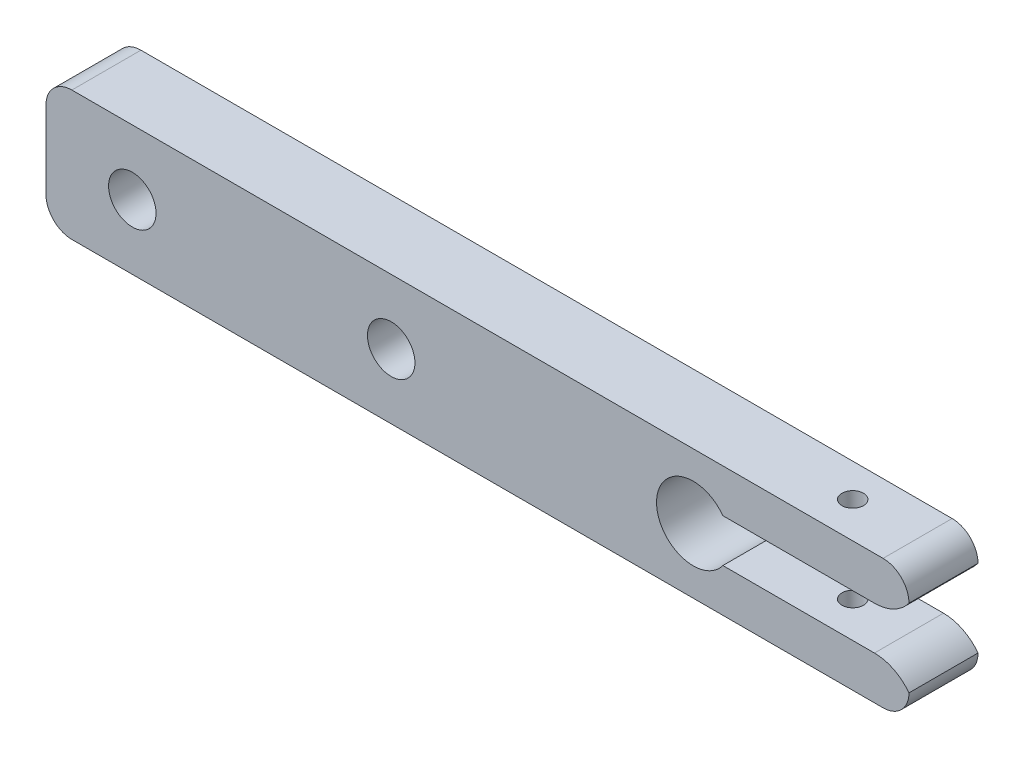
ISO-10303-21;
HEADER;
FILE_DESCRIPTION(('STEP AP214'),'2;1');
FILE_NAME('part.step','',(''),(''),'','','');
FILE_SCHEMA(('AUTOMOTIVE_DESIGN { 1 0 10303 214 1 1 1 1 }'));
ENDSEC;
DATA;
#1=APPLICATION_CONTEXT('core data for automotive mechanical design processes');
#2=APPLICATION_PROTOCOL_DEFINITION('international standard','automotive_design',2000,#1);
#3=PRODUCT_CONTEXT('',#1,'mechanical');
#4=PRODUCT('Part','Part','',(#3));
#5=PRODUCT_RELATED_PRODUCT_CATEGORY('part','',(#4));
#6=PRODUCT_DEFINITION_FORMATION('','',#4);
#7=PRODUCT_DEFINITION_CONTEXT('part definition',#1,'design');
#8=PRODUCT_DEFINITION('design','',#6,#7);
#9=PRODUCT_DEFINITION_SHAPE('','',#8);
#10=(LENGTH_UNIT() NAMED_UNIT(*) SI_UNIT(.MILLI.,.METRE.));
#11=(NAMED_UNIT(*) PLANE_ANGLE_UNIT() SI_UNIT($,.RADIAN.));
#12=(NAMED_UNIT(*) SI_UNIT($,.STERADIAN.) SOLID_ANGLE_UNIT());
#13=UNCERTAINTY_MEASURE_WITH_UNIT(LENGTH_MEASURE(1.E-05),#10,'distance_accuracy_value','');
#14=(GEOMETRIC_REPRESENTATION_CONTEXT(3) GLOBAL_UNCERTAINTY_ASSIGNED_CONTEXT((#13)) GLOBAL_UNIT_ASSIGNED_CONTEXT((#10,
#11,#12)) REPRESENTATION_CONTEXT('',''));
#15=CARTESIAN_POINT('',(0.,0.,0.));
#16=DIRECTION('',(0.,0.,1.));
#17=DIRECTION('',(1.,0.,0.));
#18=AXIS2_PLACEMENT_3D('',#15,#16,#17);
#19=CARTESIAN_POINT('',(-50.0000000000001,-7.50000000000001,8.));
#20=DIRECTION('',(0.,0.,-1.));
#21=DIRECTION('',(-1.,0.,0.));
#22=AXIS2_PLACEMENT_3D('',#19,#20,#21);
#23=PLANE('',#22);
#24=CARTESIAN_POINT('',(46.9999999999999,-4.49999999999999,8.));
#25=DIRECTION('',(0.,0.,-1.));
#26=DIRECTION('',(-1.,0.,0.));
#27=AXIS2_PLACEMENT_3D('',#24,#25,#26);
#28=CIRCLE('',#27,3.);
#29=CARTESIAN_POINT('',(46.9999999999999,-7.49999999999999,8.));
#30=VERTEX_POINT('',#29);
#31=CARTESIAN_POINT('',(49.9999999999999,-4.49999999999999,8.));
#32=VERTEX_POINT('',#31);
#33=EDGE_CURVE('E201',#30,#32,#28,.F.);
#34=ORIENTED_EDGE('',*,*,#33,.T.);
#35=CARTESIAN_POINT('',(45.9999999999999,-7.5,8.));
#36=DIRECTION('',(0.,0.,-1.));
#37=DIRECTION('',(-1.,0.,0.));
#38=AXIS2_PLACEMENT_3D('',#35,#36,#37);
#39=CIRCLE('',#38,5.);
#40=CARTESIAN_POINT('',(45.9999999999999,-2.5,8.));
#41=VERTEX_POINT('',#40);
#42=EDGE_CURVE('E141',#32,#41,#39,.F.);
#43=ORIENTED_EDGE('',*,*,#42,.T.);
#44=DIRECTION('',(1.,0.,0.));
#45=VECTOR('',#44,1.);
#46=CARTESIAN_POINT('',(25.,-2.5,8.));
#47=LINE('',#46,#45);
#48=CARTESIAN_POINT('',(28.4369317712169,-2.5,8.));
#49=VERTEX_POINT('',#48);
#50=EDGE_CURVE('E126',#49,#41,#47,.T.);
#51=ORIENTED_EDGE('',*,*,#50,.F.);
#52=CARTESIAN_POINT('',(25.,0.,8.));
#53=DIRECTION('',(0.,0.,1.));
#54=DIRECTION('',(1.,0.,0.));
#55=AXIS2_PLACEMENT_3D('',#52,#53,#54);
#56=CIRCLE('',#55,4.25000000000001);
#57=CARTESIAN_POINT('',(28.4369317712169,2.5,8.));
#58=VERTEX_POINT('',#57);
#59=EDGE_CURVE('E140',#58,#49,#56,.T.);
#60=ORIENTED_EDGE('',*,*,#59,.F.);
#61=DIRECTION('',(-1.,0.,0.));
#62=VECTOR('',#61,1.);
#63=CARTESIAN_POINT('',(25.,2.5,8.));
#64=LINE('',#63,#62);
#65=CARTESIAN_POINT('',(45.9999999999999,2.5,8.));
#66=VERTEX_POINT('',#65);
#67=EDGE_CURVE('E142',#66,#58,#64,.T.);
#68=ORIENTED_EDGE('',*,*,#67,.F.);
#69=CARTESIAN_POINT('',(45.9999999999999,7.5,8.));
#70=DIRECTION('',(0.,0.,-1.));
#71=DIRECTION('',(-1.,0.,0.));
#72=AXIS2_PLACEMENT_3D('',#69,#70,#71);
#73=CIRCLE('',#72,5.);
#74=CARTESIAN_POINT('',(49.9999999999999,4.49999999999999,8.));
#75=VERTEX_POINT('',#74);
#76=EDGE_CURVE('E216',#66,#75,#73,.F.);
#77=ORIENTED_EDGE('',*,*,#76,.T.);
#78=CARTESIAN_POINT('',(46.9999999999999,4.49999999999999,8.));
#79=DIRECTION('',(0.,0.,-1.));
#80=DIRECTION('',(-1.,0.,0.));
#81=AXIS2_PLACEMENT_3D('',#78,#79,#80);
#82=CIRCLE('',#81,3.);
#83=CARTESIAN_POINT('',(46.9999999999999,7.49999999999999,8.));
#84=VERTEX_POINT('',#83);
#85=EDGE_CURVE('E199',#75,#84,#82,.F.);
#86=ORIENTED_EDGE('',*,*,#85,.T.);
#87=DIRECTION('',(-1.,0.,0.));
#88=VECTOR('',#87,1.);
#89=CARTESIAN_POINT('',(49.9999999999999,7.49999999999999,8.));
#90=LINE('',#89,#88);
#91=CARTESIAN_POINT('',(-47.0000000000001,7.49999999999999,8.));
#92=VERTEX_POINT('',#91);
#93=EDGE_CURVE('E169',#84,#92,#90,.T.);
#94=ORIENTED_EDGE('',*,*,#93,.T.);
#95=CARTESIAN_POINT('',(-47.0000000000001,4.49999999999999,8.));
#96=DIRECTION('',(0.,0.,-1.));
#97=DIRECTION('',(-1.,0.,0.));
#98=AXIS2_PLACEMENT_3D('',#95,#96,#97);
#99=CIRCLE('',#98,3.);
#100=CARTESIAN_POINT('',(-50.0000000000001,4.49999999999999,8.));
#101=VERTEX_POINT('',#100);
#102=EDGE_CURVE('E197',#92,#101,#99,.F.);
#103=ORIENTED_EDGE('',*,*,#102,.T.);
#104=DIRECTION('',(0.,-1.,0.));
#105=VECTOR('',#104,1.);
#106=CARTESIAN_POINT('',(-50.0000000000001,7.49999999999999,8.));
#107=LINE('',#106,#105);
#108=CARTESIAN_POINT('',(-50.0000000000001,-4.5,8.));
#109=VERTEX_POINT('',#108);
#110=EDGE_CURVE('E162',#101,#109,#107,.T.);
#111=ORIENTED_EDGE('',*,*,#110,.T.);
#112=CARTESIAN_POINT('',(-47.0000000000001,-4.5,8.));
#113=DIRECTION('',(0.,0.,-1.));
#114=DIRECTION('',(-1.,0.,0.));
#115=AXIS2_PLACEMENT_3D('',#112,#113,#114);
#116=CIRCLE('',#115,3.);
#117=CARTESIAN_POINT('',(-47.0000000000001,-7.50000000000001,8.));
#118=VERTEX_POINT('',#117);
#119=EDGE_CURVE('E203',#109,#118,#116,.F.);
#120=ORIENTED_EDGE('',*,*,#119,.T.);
#121=DIRECTION('',(1.,0.,0.));
#122=VECTOR('',#121,1.);
#123=CARTESIAN_POINT('',(49.9999999999999,-7.49999999999999,8.));
#124=LINE('',#123,#122);
#125=EDGE_CURVE('E165',#118,#30,#124,.T.);
#126=ORIENTED_EDGE('',*,*,#125,.T.);
#127=EDGE_LOOP('',(#34,#43,#51,#60,#68,#77,#86,#94,#103,#111,#120,#126));
#128=FACE_BOUND('',#127,.T.);
#129=CARTESIAN_POINT('',(-10.,0.,8.));
#130=DIRECTION('',(0.,0.,1.));
#131=DIRECTION('',(1.,0.,0.));
#132=AXIS2_PLACEMENT_3D('',#129,#130,#131);
#133=CIRCLE('',#132,2.75000000000001);
#134=CARTESIAN_POINT('',(-7.25000000000001,0.,8.));
#135=VERTEX_POINT('',#134);
#136=EDGE_CURVE('E151',#135,#135,#133,.T.);
#137=ORIENTED_EDGE('',*,*,#136,.F.);
#138=EDGE_LOOP('',(#137));
#139=FACE_BOUND('',#138,.T.);
#140=CARTESIAN_POINT('',(-40.,0.,8.));
#141=DIRECTION('',(0.,0.,1.));
#142=DIRECTION('',(1.,0.,0.));
#143=AXIS2_PLACEMENT_3D('',#140,#141,#142);
#144=CIRCLE('',#143,2.75000000000002);
#145=CARTESIAN_POINT('',(-37.25,0.,8.));
#146=VERTEX_POINT('',#145);
#147=EDGE_CURVE('E153',#146,#146,#144,.T.);
#148=ORIENTED_EDGE('',*,*,#147,.F.);
#149=EDGE_LOOP('',(#148));
#150=FACE_BOUND('',#149,.T.);
#151=ADVANCED_FACE('F35',(#128,#139,#150),#23,.F.);
#152=CARTESIAN_POINT('',(-50.0000000000001,-7.50000000000001,0.));
#153=DIRECTION('',(0.,0.,-1.));
#154=DIRECTION('',(-1.,0.,0.));
#155=AXIS2_PLACEMENT_3D('',#152,#153,#154);
#156=PLANE('',#155);
#157=DIRECTION('',(-1.,0.,0.));
#158=VECTOR('',#157,1.);
#159=CARTESIAN_POINT('',(-50.0000000000001,-2.5,0.));
#160=LINE('',#159,#158);
#161=CARTESIAN_POINT('',(45.9999999999999,-2.5,0.));
#162=VERTEX_POINT('',#161);
#163=CARTESIAN_POINT('',(28.4369317712169,-2.5,0.));
#164=VERTEX_POINT('',#163);
#165=EDGE_CURVE('E127',#162,#164,#160,.T.);
#166=ORIENTED_EDGE('',*,*,#165,.F.);
#167=CARTESIAN_POINT('',(45.9999999999999,-7.5,0.));
#168=DIRECTION('',(0.,0.,-1.));
#169=DIRECTION('',(-1.,0.,0.));
#170=AXIS2_PLACEMENT_3D('',#167,#168,#169);
#171=CIRCLE('',#170,5.);
#172=CARTESIAN_POINT('',(49.9999999999999,-4.49999999999999,0.));
#173=VERTEX_POINT('',#172);
#174=EDGE_CURVE('E43',#162,#173,#171,.T.);
#175=ORIENTED_EDGE('',*,*,#174,.T.);
#176=CARTESIAN_POINT('',(46.9999999999999,-4.49999999999999,0.));
#177=DIRECTION('',(0.,0.,-1.));
#178=DIRECTION('',(-1.,0.,0.));
#179=AXIS2_PLACEMENT_3D('',#176,#177,#178);
#180=CIRCLE('',#179,3.);
#181=CARTESIAN_POINT('',(46.9999999999999,-7.49999999999999,0.));
#182=VERTEX_POINT('',#181);
#183=EDGE_CURVE('E188',#173,#182,#180,.T.);
#184=ORIENTED_EDGE('',*,*,#183,.T.);
#185=DIRECTION('',(1.,0.,0.));
#186=VECTOR('',#185,1.);
#187=CARTESIAN_POINT('',(49.9999999999999,-7.49999999999999,0.));
#188=LINE('',#187,#186);
#189=CARTESIAN_POINT('',(-47.0000000000001,-7.50000000000001,0.));
#190=VERTEX_POINT('',#189);
#191=EDGE_CURVE('E175',#190,#182,#188,.T.);
#192=ORIENTED_EDGE('',*,*,#191,.F.);
#193=CARTESIAN_POINT('',(-47.0000000000001,-4.5,0.));
#194=DIRECTION('',(0.,0.,-1.));
#195=DIRECTION('',(-1.,0.,0.));
#196=AXIS2_PLACEMENT_3D('',#193,#194,#195);
#197=CIRCLE('',#196,3.);
#198=CARTESIAN_POINT('',(-50.0000000000001,-4.5,0.));
#199=VERTEX_POINT('',#198);
#200=EDGE_CURVE('E190',#190,#199,#197,.T.);
#201=ORIENTED_EDGE('',*,*,#200,.T.);
#202=DIRECTION('',(0.,-1.,0.));
#203=VECTOR('',#202,1.);
#204=CARTESIAN_POINT('',(-50.0000000000001,7.49999999999999,0.));
#205=LINE('',#204,#203);
#206=CARTESIAN_POINT('',(-50.0000000000001,4.49999999999999,0.));
#207=VERTEX_POINT('',#206);
#208=EDGE_CURVE('E160',#207,#199,#205,.T.);
#209=ORIENTED_EDGE('',*,*,#208,.F.);
#210=CARTESIAN_POINT('',(-47.0000000000001,4.49999999999999,0.));
#211=DIRECTION('',(0.,0.,-1.));
#212=DIRECTION('',(-1.,0.,0.));
#213=AXIS2_PLACEMENT_3D('',#210,#211,#212);
#214=CIRCLE('',#213,3.);
#215=CARTESIAN_POINT('',(-47.0000000000001,7.49999999999999,0.));
#216=VERTEX_POINT('',#215);
#217=EDGE_CURVE('E184',#207,#216,#214,.T.);
#218=ORIENTED_EDGE('',*,*,#217,.T.);
#219=DIRECTION('',(-1.,0.,0.));
#220=VECTOR('',#219,1.);
#221=CARTESIAN_POINT('',(49.9999999999999,7.49999999999999,0.));
#222=LINE('',#221,#220);
#223=CARTESIAN_POINT('',(46.9999999999999,7.49999999999999,0.));
#224=VERTEX_POINT('',#223);
#225=EDGE_CURVE('E166',#224,#216,#222,.T.);
#226=ORIENTED_EDGE('',*,*,#225,.F.);
#227=CARTESIAN_POINT('',(46.9999999999999,4.49999999999999,0.));
#228=DIRECTION('',(0.,0.,-1.));
#229=DIRECTION('',(-1.,0.,0.));
#230=AXIS2_PLACEMENT_3D('',#227,#228,#229);
#231=CIRCLE('',#230,3.);
#232=CARTESIAN_POINT('',(49.9999999999999,4.49999999999999,0.));
#233=VERTEX_POINT('',#232);
#234=EDGE_CURVE('E186',#224,#233,#231,.T.);
#235=ORIENTED_EDGE('',*,*,#234,.T.);
#236=CARTESIAN_POINT('',(45.9999999999999,7.5,0.));
#237=DIRECTION('',(0.,0.,-1.));
#238=DIRECTION('',(-1.,0.,0.));
#239=AXIS2_PLACEMENT_3D('',#236,#237,#238);
#240=CIRCLE('',#239,5.);
#241=CARTESIAN_POINT('',(45.9999999999999,2.5,0.));
#242=VERTEX_POINT('',#241);
#243=EDGE_CURVE('E50',#233,#242,#240,.T.);
#244=ORIENTED_EDGE('',*,*,#243,.T.);
#245=DIRECTION('',(1.,0.,0.));
#246=VECTOR('',#245,1.);
#247=CARTESIAN_POINT('',(-50.0000000000001,2.5,0.));
#248=LINE('',#247,#246);
#249=CARTESIAN_POINT('',(28.4369317712169,2.5,0.));
#250=VERTEX_POINT('',#249);
#251=EDGE_CURVE('E267',#250,#242,#248,.T.);
#252=ORIENTED_EDGE('',*,*,#251,.F.);
#253=CARTESIAN_POINT('',(25.,0.,0.));
#254=DIRECTION('',(0.,0.,1.));
#255=DIRECTION('',(1.,0.,0.));
#256=AXIS2_PLACEMENT_3D('',#253,#254,#255);
#257=CIRCLE('',#256,4.25000000000001);
#258=EDGE_CURVE('E148',#250,#164,#257,.T.);
#259=ORIENTED_EDGE('',*,*,#258,.T.);
#260=EDGE_LOOP('',(#166,#175,#184,#192,#201,#209,#218,#226,#235,#244,#252,#259));
#261=FACE_BOUND('',#260,.T.);
#262=CARTESIAN_POINT('',(-10.,0.,0.));
#263=DIRECTION('',(0.,0.,1.));
#264=DIRECTION('',(1.,0.,0.));
#265=AXIS2_PLACEMENT_3D('',#262,#263,#264);
#266=CIRCLE('',#265,2.75000000000001);
#267=CARTESIAN_POINT('',(-7.25000000000001,0.,0.));
#268=VERTEX_POINT('',#267);
#269=EDGE_CURVE('E147',#268,#268,#266,.T.);
#270=ORIENTED_EDGE('',*,*,#269,.T.);
#271=EDGE_LOOP('',(#270));
#272=FACE_BOUND('',#271,.T.);
#273=CARTESIAN_POINT('',(-40.,0.,0.));
#274=DIRECTION('',(0.,0.,1.));
#275=DIRECTION('',(1.,0.,0.));
#276=AXIS2_PLACEMENT_3D('',#273,#274,#275);
#277=CIRCLE('',#276,2.75000000000002);
#278=CARTESIAN_POINT('',(-37.25,0.,0.));
#279=VERTEX_POINT('',#278);
#280=EDGE_CURVE('E156',#279,#279,#277,.T.);
#281=ORIENTED_EDGE('',*,*,#280,.T.);
#282=EDGE_LOOP('',(#281));
#283=FACE_BOUND('',#282,.T.);
#284=ADVANCED_FACE('F226',(#261,#272,#283),#156,.T.);
#285=CARTESIAN_POINT('',(-50.0000000000001,7.49999999999999,8.));
#286=DIRECTION('',(1.,0.,0.));
#287=DIRECTION('',(0.,0.,-1.));
#288=AXIS2_PLACEMENT_3D('',#285,#286,#287);
#289=PLANE('',#288);
#290=ORIENTED_EDGE('',*,*,#208,.T.);
#291=DIRECTION('',(0.,0.,-1.));
#292=VECTOR('',#291,1.);
#293=CARTESIAN_POINT('',(-50.0000000000001,-4.5,8.));
#294=LINE('',#293,#292);
#295=EDGE_CURVE('E195',#199,#109,#294,.F.);
#296=ORIENTED_EDGE('',*,*,#295,.T.);
#297=ORIENTED_EDGE('',*,*,#110,.F.);
#298=DIRECTION('',(0.,0.,-1.));
#299=VECTOR('',#298,1.);
#300=CARTESIAN_POINT('',(-50.0000000000001,4.49999999999999,8.));
#301=LINE('',#300,#299);
#302=EDGE_CURVE('E192',#101,#207,#301,.T.);
#303=ORIENTED_EDGE('',*,*,#302,.T.);
#304=EDGE_LOOP('',(#290,#296,#297,#303));
#305=FACE_BOUND('',#304,.T.);
#306=ADVANCED_FACE('F246',(#305),#289,.F.);
#307=CARTESIAN_POINT('',(49.9999999999999,-7.49999999999999,8.));
#308=DIRECTION('',(0.,1.,0.));
#309=DIRECTION('',(-1.,0.,0.));
#310=AXIS2_PLACEMENT_3D('',#307,#308,#309);
#311=PLANE('',#310);
#312=CARTESIAN_POINT('',(39.3247891017125,-7.49999999999999,3.84561598622213));
#313=DIRECTION('',(0.,-1.,0.));
#314=DIRECTION('',(0.,0.,-1.));
#315=AXIS2_PLACEMENT_3D('',#312,#313,#314);
#316=CIRCLE('',#315,1.24999999999999);
#317=CARTESIAN_POINT('',(39.3247891017125,-7.49999999999999,2.59561598622214));
#318=VERTEX_POINT('',#317);
#319=EDGE_CURVE('E338',#318,#318,#316,.T.);
#320=ORIENTED_EDGE('',*,*,#319,.F.);
#321=EDGE_LOOP('',(#320));
#322=FACE_BOUND('',#321,.T.);
#323=ORIENTED_EDGE('',*,*,#125,.F.);
#324=DIRECTION('',(0.,0.,-1.));
#325=VECTOR('',#324,1.);
#326=CARTESIAN_POINT('',(-47.0000000000001,-7.50000000000001,8.));
#327=LINE('',#326,#325);
#328=EDGE_CURVE('E181',#118,#190,#327,.T.);
#329=ORIENTED_EDGE('',*,*,#328,.T.);
#330=ORIENTED_EDGE('',*,*,#191,.T.);
#331=DIRECTION('',(0.,0.,-1.));
#332=VECTOR('',#331,1.);
#333=CARTESIAN_POINT('',(46.9999999999999,-7.49999999999999,8.));
#334=LINE('',#333,#332);
#335=EDGE_CURVE('E172',#182,#30,#334,.F.);
#336=ORIENTED_EDGE('',*,*,#335,.T.);
#337=EDGE_LOOP('',(#323,#329,#330,#336));
#338=FACE_BOUND('',#337,.T.);
#339=ADVANCED_FACE('F240',(#322,#338),#311,.F.);
#340=CARTESIAN_POINT('',(49.9999999999999,7.49999999999999,8.));
#341=DIRECTION('',(0.,-1.,0.));
#342=DIRECTION('',(1.,0.,0.));
#343=AXIS2_PLACEMENT_3D('',#340,#341,#342);
#344=PLANE('',#343);
#345=CARTESIAN_POINT('',(39.3247891017125,7.50000000000001,3.84561598622213));
#346=DIRECTION('',(0.,-1.,0.));
#347=DIRECTION('',(0.,0.,-1.));
#348=AXIS2_PLACEMENT_3D('',#345,#346,#347);
#349=CIRCLE('',#348,1.24999999999999);
#350=CARTESIAN_POINT('',(39.3247891017125,7.50000000000001,2.59561598622213));
#351=VERTEX_POINT('',#350);
#352=EDGE_CURVE('E220',#351,#351,#349,.T.);
#353=ORIENTED_EDGE('',*,*,#352,.T.);
#354=EDGE_LOOP('',(#353));
#355=FACE_BOUND('',#354,.T.);
#356=ORIENTED_EDGE('',*,*,#93,.F.);
#357=DIRECTION('',(0.,0.,-1.));
#358=VECTOR('',#357,1.);
#359=CARTESIAN_POINT('',(46.9999999999999,7.49999999999999,8.));
#360=LINE('',#359,#358);
#361=EDGE_CURVE('E133',#84,#224,#360,.T.);
#362=ORIENTED_EDGE('',*,*,#361,.T.);
#363=ORIENTED_EDGE('',*,*,#225,.T.);
#364=DIRECTION('',(0.,0.,-1.));
#365=VECTOR('',#364,1.);
#366=CARTESIAN_POINT('',(-47.0000000000001,7.49999999999999,8.));
#367=LINE('',#366,#365);
#368=EDGE_CURVE('E211',#216,#92,#367,.F.);
#369=ORIENTED_EDGE('',*,*,#368,.T.);
#370=EDGE_LOOP('',(#356,#362,#363,#369));
#371=FACE_BOUND('',#370,.T.);
#372=ADVANCED_FACE('F256',(#355,#371),#344,.F.);
#373=CARTESIAN_POINT('',(-10.,0.,8.));
#374=DIRECTION('',(0.,0.,-1.));
#375=DIRECTION('',(-1.,0.,0.));
#376=AXIS2_PLACEMENT_3D('',#373,#374,#375);
#377=CYLINDRICAL_SURFACE('',#376,2.75000000000001);
#378=ORIENTED_EDGE('',*,*,#136,.T.);
#379=EDGE_LOOP('',(#378));
#380=FACE_BOUND('',#379,.T.);
#381=ORIENTED_EDGE('',*,*,#269,.F.);
#382=EDGE_LOOP('',(#381));
#383=FACE_BOUND('',#382,.T.);
#384=ADVANCED_FACE('F287',(#380,#383),#377,.F.);
#385=CARTESIAN_POINT('',(25.,0.,8.));
#386=DIRECTION('',(0.,0.,-1.));
#387=DIRECTION('',(-1.,0.,0.));
#388=AXIS2_PLACEMENT_3D('',#385,#386,#387);
#389=CYLINDRICAL_SURFACE('',#388,4.25000000000001);
#390=DIRECTION('',(0.,0.,-1.));
#391=VECTOR('',#390,1.);
#392=CARTESIAN_POINT('',(28.4369317712169,2.5,8.));
#393=LINE('',#392,#391);
#394=EDGE_CURVE('E132',#58,#250,#393,.T.);
#395=ORIENTED_EDGE('',*,*,#394,.F.);
#396=ORIENTED_EDGE('',*,*,#59,.T.);
#397=DIRECTION('',(0.,0.,-1.));
#398=VECTOR('',#397,1.);
#399=CARTESIAN_POINT('',(28.4369317712169,-2.5,8.));
#400=LINE('',#399,#398);
#401=EDGE_CURVE('E123',#164,#49,#400,.F.);
#402=ORIENTED_EDGE('',*,*,#401,.F.);
#403=ORIENTED_EDGE('',*,*,#258,.F.);
#404=EDGE_LOOP('',(#395,#396,#402,#403));
#405=FACE_BOUND('',#404,.T.);
#406=ADVANCED_FACE('F146',(#405),#389,.F.);
#407=CARTESIAN_POINT('',(-40.,0.,8.));
#408=DIRECTION('',(0.,0.,-1.));
#409=DIRECTION('',(-1.,0.,0.));
#410=AXIS2_PLACEMENT_3D('',#407,#408,#409);
#411=CYLINDRICAL_SURFACE('',#410,2.75000000000002);
#412=ORIENTED_EDGE('',*,*,#147,.T.);
#413=EDGE_LOOP('',(#412));
#414=FACE_BOUND('',#413,.T.);
#415=ORIENTED_EDGE('',*,*,#280,.F.);
#416=EDGE_LOOP('',(#415));
#417=FACE_BOUND('',#416,.T.);
#418=ADVANCED_FACE('F279',(#414,#417),#411,.F.);
#419=CARTESIAN_POINT('',(-47.0000000000001,-4.5,8.));
#420=DIRECTION('',(0.,0.,-1.));
#421=DIRECTION('',(-1.,0.,0.));
#422=AXIS2_PLACEMENT_3D('',#419,#420,#421);
#423=CYLINDRICAL_SURFACE('',#422,3.);
#424=ORIENTED_EDGE('',*,*,#119,.F.);
#425=ORIENTED_EDGE('',*,*,#295,.F.);
#426=ORIENTED_EDGE('',*,*,#200,.F.);
#427=ORIENTED_EDGE('',*,*,#328,.F.);
#428=EDGE_LOOP('',(#424,#425,#426,#427));
#429=FACE_BOUND('',#428,.T.);
#430=ADVANCED_FACE('F242',(#429),#423,.T.);
#431=CARTESIAN_POINT('',(46.9999999999999,-4.49999999999999,8.));
#432=DIRECTION('',(0.,0.,-1.));
#433=DIRECTION('',(-1.,0.,0.));
#434=AXIS2_PLACEMENT_3D('',#431,#432,#433);
#435=CYLINDRICAL_SURFACE('',#434,3.);
#436=ORIENTED_EDGE('',*,*,#33,.F.);
#437=ORIENTED_EDGE('',*,*,#335,.F.);
#438=ORIENTED_EDGE('',*,*,#183,.F.);
#439=DIRECTION('',(0.,0.,-1.));
#440=VECTOR('',#439,1.);
#441=CARTESIAN_POINT('',(49.9999999999999,-4.49999999999999,8.));
#442=LINE('',#441,#440);
#443=EDGE_CURVE('E208',#32,#173,#442,.T.);
#444=ORIENTED_EDGE('',*,*,#443,.F.);
#445=EDGE_LOOP('',(#436,#437,#438,#444));
#446=FACE_BOUND('',#445,.T.);
#447=ADVANCED_FACE('F234',(#446),#435,.T.);
#448=CARTESIAN_POINT('',(46.9999999999999,4.49999999999999,8.));
#449=DIRECTION('',(0.,0.,-1.));
#450=DIRECTION('',(-1.,0.,0.));
#451=AXIS2_PLACEMENT_3D('',#448,#449,#450);
#452=CYLINDRICAL_SURFACE('',#451,3.);
#453=ORIENTED_EDGE('',*,*,#85,.F.);
#454=DIRECTION('',(0.,0.,-1.));
#455=VECTOR('',#454,1.);
#456=CARTESIAN_POINT('',(49.9999999999999,4.49999999999999,8.));
#457=LINE('',#456,#455);
#458=EDGE_CURVE('E205',#233,#75,#457,.F.);
#459=ORIENTED_EDGE('',*,*,#458,.F.);
#460=ORIENTED_EDGE('',*,*,#234,.F.);
#461=ORIENTED_EDGE('',*,*,#361,.F.);
#462=EDGE_LOOP('',(#453,#459,#460,#461));
#463=FACE_BOUND('',#462,.T.);
#464=ADVANCED_FACE('F260',(#463),#452,.T.);
#465=CARTESIAN_POINT('',(-47.0000000000001,4.49999999999999,8.));
#466=DIRECTION('',(0.,0.,-1.));
#467=DIRECTION('',(-1.,0.,0.));
#468=AXIS2_PLACEMENT_3D('',#465,#466,#467);
#469=CYLINDRICAL_SURFACE('',#468,3.);
#470=ORIENTED_EDGE('',*,*,#102,.F.);
#471=ORIENTED_EDGE('',*,*,#368,.F.);
#472=ORIENTED_EDGE('',*,*,#217,.F.);
#473=ORIENTED_EDGE('',*,*,#302,.F.);
#474=EDGE_LOOP('',(#470,#471,#472,#473));
#475=FACE_BOUND('',#474,.T.);
#476=ADVANCED_FACE('F251',(#475),#469,.T.);
#477=CARTESIAN_POINT('',(25.,-2.5,-22.));
#478=DIRECTION('',(0.,-1.,0.));
#479=DIRECTION('',(0.,0.,-1.));
#480=AXIS2_PLACEMENT_3D('',#477,#478,#479);
#481=PLANE('',#480);
#482=CARTESIAN_POINT('',(39.3247891017125,-2.5,3.84561598622213));
#483=DIRECTION('',(0.,-1.,0.));
#484=DIRECTION('',(0.,0.,-1.));
#485=AXIS2_PLACEMENT_3D('',#482,#483,#484);
#486=CIRCLE('',#485,1.24999999999999);
#487=CARTESIAN_POINT('',(39.3247891017125,-2.5,2.59561598622214));
#488=VERTEX_POINT('',#487);
#489=EDGE_CURVE('E143',#488,#488,#486,.T.);
#490=ORIENTED_EDGE('',*,*,#489,.T.);
#491=EDGE_LOOP('',(#490));
#492=FACE_BOUND('',#491,.T.);
#493=ORIENTED_EDGE('',*,*,#50,.T.);
#494=DIRECTION('',(0.,0.,-1.));
#495=VECTOR('',#494,1.);
#496=CARTESIAN_POINT('',(45.9999999999999,-2.5,-22.));
#497=LINE('',#496,#495);
#498=EDGE_CURVE('E58',#41,#162,#497,.T.);
#499=ORIENTED_EDGE('',*,*,#498,.T.);
#500=ORIENTED_EDGE('',*,*,#165,.T.);
#501=ORIENTED_EDGE('',*,*,#401,.T.);
#502=EDGE_LOOP('',(#493,#499,#500,#501));
#503=FACE_BOUND('',#502,.T.);
#504=ADVANCED_FACE('F125',(#492,#503),#481,.F.);
#505=CARTESIAN_POINT('',(25.,2.5,-22.));
#506=DIRECTION('',(0.,1.,0.));
#507=DIRECTION('',(0.,0.,1.));
#508=AXIS2_PLACEMENT_3D('',#505,#506,#507);
#509=PLANE('',#508);
#510=CARTESIAN_POINT('',(39.3247891017125,2.5,3.84561598622213));
#511=DIRECTION('',(0.,1.,0.));
#512=DIRECTION('',(0.,0.,1.));
#513=AXIS2_PLACEMENT_3D('',#510,#511,#512);
#514=CIRCLE('',#513,1.24999999999999);
#515=CARTESIAN_POINT('',(39.3247891017125,2.5,5.09561598622212));
#516=VERTEX_POINT('',#515);
#517=EDGE_CURVE('E217',#516,#516,#514,.T.);
#518=ORIENTED_EDGE('',*,*,#517,.T.);
#519=EDGE_LOOP('',(#518));
#520=FACE_BOUND('',#519,.T.);
#521=ORIENTED_EDGE('',*,*,#251,.T.);
#522=DIRECTION('',(0.,0.,-1.));
#523=VECTOR('',#522,1.);
#524=CARTESIAN_POINT('',(45.9999999999999,2.5,-22.));
#525=LINE('',#524,#523);
#526=EDGE_CURVE('E11',#242,#66,#525,.F.);
#527=ORIENTED_EDGE('',*,*,#526,.T.);
#528=ORIENTED_EDGE('',*,*,#67,.T.);
#529=ORIENTED_EDGE('',*,*,#394,.T.);
#530=EDGE_LOOP('',(#521,#527,#528,#529));
#531=FACE_BOUND('',#530,.T.);
#532=ADVANCED_FACE('F266',(#520,#531),#509,.F.);
#533=CARTESIAN_POINT('',(39.3247891017125,-7.49999999999999,3.84561598622213));
#534=DIRECTION('',(0.,-1.,0.));
#535=DIRECTION('',(0.,0.,-1.));
#536=AXIS2_PLACEMENT_3D('',#533,#534,#535);
#537=CYLINDRICAL_SURFACE('',#536,1.24999999999999);
#538=ORIENTED_EDGE('',*,*,#352,.F.);
#539=EDGE_LOOP('',(#538));
#540=FACE_BOUND('',#539,.T.);
#541=ORIENTED_EDGE('',*,*,#517,.F.);
#542=EDGE_LOOP('',(#541));
#543=FACE_BOUND('',#542,.T.);
#544=ADVANCED_FACE('F317',(#540,#543),#537,.F.);
#545=ORIENTED_EDGE('',*,*,#319,.T.);
#546=EDGE_LOOP('',(#545));
#547=FACE_BOUND('',#546,.T.);
#548=ORIENTED_EDGE('',*,*,#489,.F.);
#549=EDGE_LOOP('',(#548));
#550=FACE_BOUND('',#549,.T.);
#551=ADVANCED_FACE('F312',(#547,#550),#537,.F.);
#552=CARTESIAN_POINT('',(45.9999999999999,-7.5,8.));
#553=DIRECTION('',(0.,0.,-1.));
#554=DIRECTION('',(-1.,0.,0.));
#555=AXIS2_PLACEMENT_3D('',#552,#553,#554);
#556=CYLINDRICAL_SURFACE('',#555,5.);
#557=ORIENTED_EDGE('',*,*,#174,.F.);
#558=ORIENTED_EDGE('',*,*,#498,.F.);
#559=ORIENTED_EDGE('',*,*,#42,.F.);
#560=ORIENTED_EDGE('',*,*,#443,.T.);
#561=EDGE_LOOP('',(#557,#558,#559,#560));
#562=FACE_BOUND('',#561,.T.);
#563=ADVANCED_FACE('F235',(#562),#556,.T.);
#564=CARTESIAN_POINT('',(45.9999999999999,7.5,8.));
#565=DIRECTION('',(0.,0.,-1.));
#566=DIRECTION('',(-1.,0.,0.));
#567=AXIS2_PLACEMENT_3D('',#564,#565,#566);
#568=CYLINDRICAL_SURFACE('',#567,5.);
#569=ORIENTED_EDGE('',*,*,#76,.F.);
#570=ORIENTED_EDGE('',*,*,#526,.F.);
#571=ORIENTED_EDGE('',*,*,#243,.F.);
#572=ORIENTED_EDGE('',*,*,#458,.T.);
#573=EDGE_LOOP('',(#569,#570,#571,#572));
#574=FACE_BOUND('',#573,.T.);
#575=ADVANCED_FACE('F37',(#574),#568,.T.);
#576=CLOSED_SHELL('',(#151,#284,#306,#339,#372,#384,#406,#418,#430,#447,#464,#476,#504,#532,
#544,#551,#563,#575));
#577=MANIFOLD_SOLID_BREP('B2',#576);
#578=ADVANCED_BREP_SHAPE_REPRESENTATION('',(#18,#577),#14);
#579=SHAPE_DEFINITION_REPRESENTATION(#9,#578);
ENDSEC;
END-ISO-10303-21;
